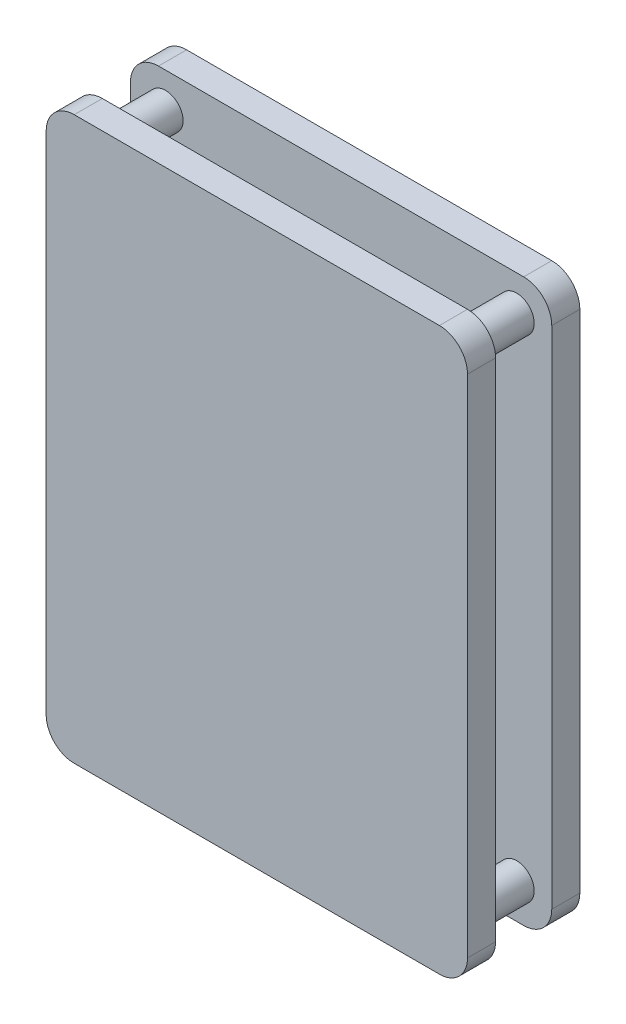
ISO-10303-21;
HEADER;
FILE_DESCRIPTION(('STEP AP214'),'2;1');
FILE_NAME('part.step','',(''),(''),'','','');
FILE_SCHEMA(('AUTOMOTIVE_DESIGN { 1 0 10303 214 1 1 1 1 }'));
ENDSEC;
DATA;
#1=APPLICATION_CONTEXT('core data for automotive mechanical design processes');
#2=APPLICATION_PROTOCOL_DEFINITION('international standard','automotive_design',2000,#1);
#3=PRODUCT_CONTEXT('',#1,'mechanical');
#4=PRODUCT('Part','Part','',(#3));
#5=PRODUCT_RELATED_PRODUCT_CATEGORY('part','',(#4));
#6=PRODUCT_DEFINITION_FORMATION('','',#4);
#7=PRODUCT_DEFINITION_CONTEXT('part definition',#1,'design');
#8=PRODUCT_DEFINITION('design','',#6,#7);
#9=PRODUCT_DEFINITION_SHAPE('','',#8);
#10=(LENGTH_UNIT() NAMED_UNIT(*) SI_UNIT(.MILLI.,.METRE.));
#11=(NAMED_UNIT(*) PLANE_ANGLE_UNIT() SI_UNIT($,.RADIAN.));
#12=(NAMED_UNIT(*) SI_UNIT($,.STERADIAN.) SOLID_ANGLE_UNIT());
#13=UNCERTAINTY_MEASURE_WITH_UNIT(LENGTH_MEASURE(1.E-05),#10,'distance_accuracy_value','');
#14=(GEOMETRIC_REPRESENTATION_CONTEXT(3) GLOBAL_UNCERTAINTY_ASSIGNED_CONTEXT((#13)) GLOBAL_UNIT_ASSIGNED_CONTEXT((#10,
#11,#12)) REPRESENTATION_CONTEXT('',''));
#15=CARTESIAN_POINT('',(0.,0.,0.));
#16=DIRECTION('',(0.,0.,1.));
#17=DIRECTION('',(1.,0.,0.));
#18=AXIS2_PLACEMENT_3D('',#15,#16,#17);
#19=CARTESIAN_POINT('',(-83.5858711935384,-160.,2.));
#20=DIRECTION('',(1.,0.,0.));
#21=DIRECTION('',(0.,0.,-1.));
#22=AXIS2_PLACEMENT_3D('',#19,#20,#21);
#23=PLANE('',#22);
#24=DIRECTION('',(0.,-1.,0.));
#25=VECTOR('',#24,1.);
#26=CARTESIAN_POINT('',(-83.5858711935384,-160.,2.));
#27=LINE('',#26,#25);
#28=CARTESIAN_POINT('',(-83.5858711935384,-162.,2.));
#29=VERTEX_POINT('',#28);
#30=CARTESIAN_POINT('',(-83.5858711935384,-198.,2.));
#31=VERTEX_POINT('',#30);
#32=EDGE_CURVE('E200',#29,#31,#27,.T.);
#33=ORIENTED_EDGE('',*,*,#32,.F.);
#34=DIRECTION('',(0.,0.,-1.));
#35=VECTOR('',#34,1.);
#36=CARTESIAN_POINT('',(-83.5858711935384,-162.,2.));
#37=LINE('',#36,#35);
#38=CARTESIAN_POINT('',(-83.5858711935384,-162.,0.));
#39=VERTEX_POINT('',#38);
#40=EDGE_CURVE('E247',#29,#39,#37,.T.);
#41=ORIENTED_EDGE('',*,*,#40,.T.);
#42=DIRECTION('',(0.,-1.,0.));
#43=VECTOR('',#42,1.);
#44=CARTESIAN_POINT('',(-83.5858711935384,-160.,0.));
#45=LINE('',#44,#43);
#46=CARTESIAN_POINT('',(-83.5858711935384,-198.,0.));
#47=VERTEX_POINT('',#46);
#48=EDGE_CURVE('E197',#39,#47,#45,.T.);
#49=ORIENTED_EDGE('',*,*,#48,.T.);
#50=DIRECTION('',(0.,0.,-1.));
#51=VECTOR('',#50,1.);
#52=CARTESIAN_POINT('',(-83.5858711935384,-198.,2.));
#53=LINE('',#52,#51);
#54=EDGE_CURVE('E245',#47,#31,#53,.F.);
#55=ORIENTED_EDGE('',*,*,#54,.T.);
#56=EDGE_LOOP('',(#33,#41,#49,#55));
#57=FACE_BOUND('',#56,.T.);
#58=ADVANCED_FACE('F32',(#57),#23,.F.);
#59=CARTESIAN_POINT('',(-83.5858711935384,-200.,2.));
#60=DIRECTION('',(0.,1.,0.));
#61=DIRECTION('',(0.,0.,1.));
#62=AXIS2_PLACEMENT_3D('',#59,#60,#61);
#63=PLANE('',#62);
#64=DIRECTION('',(1.,0.,0.));
#65=VECTOR('',#64,1.);
#66=CARTESIAN_POINT('',(-83.5858711935384,-200.,0.));
#67=LINE('',#66,#65);
#68=CARTESIAN_POINT('',(-81.5858711935384,-200.,0.));
#69=VERTEX_POINT('',#68);
#70=CARTESIAN_POINT('',(-55.5858711935384,-200.,0.));
#71=VERTEX_POINT('',#70);
#72=EDGE_CURVE('E214',#69,#71,#67,.T.);
#73=ORIENTED_EDGE('',*,*,#72,.T.);
#74=DIRECTION('',(0.,0.,-1.));
#75=VECTOR('',#74,1.);
#76=CARTESIAN_POINT('',(-55.5858711935384,-200.,2.));
#77=LINE('',#76,#75);
#78=CARTESIAN_POINT('',(-55.5858711935384,-200.,2.));
#79=VERTEX_POINT('',#78);
#80=EDGE_CURVE('E11',#71,#79,#77,.F.);
#81=ORIENTED_EDGE('',*,*,#80,.T.);
#82=DIRECTION('',(1.,0.,0.));
#83=VECTOR('',#82,1.);
#84=CARTESIAN_POINT('',(-83.5858711935384,-200.,2.));
#85=LINE('',#84,#83);
#86=CARTESIAN_POINT('',(-81.5858711935384,-200.,2.));
#87=VERTEX_POINT('',#86);
#88=EDGE_CURVE('E202',#87,#79,#85,.T.);
#89=ORIENTED_EDGE('',*,*,#88,.F.);
#90=DIRECTION('',(0.,0.,-1.));
#91=VECTOR('',#90,1.);
#92=CARTESIAN_POINT('',(-81.5858711935384,-200.,2.));
#93=LINE('',#92,#91);
#94=EDGE_CURVE('E40',#87,#69,#93,.T.);
#95=ORIENTED_EDGE('',*,*,#94,.T.);
#96=EDGE_LOOP('',(#73,#81,#89,#95));
#97=FACE_BOUND('',#96,.T.);
#98=ADVANCED_FACE('F252',(#97),#63,.F.);
#99=CARTESIAN_POINT('',(-53.5858711935384,-160.,2.));
#100=DIRECTION('',(-1.,0.,0.));
#101=DIRECTION('',(0.,0.,1.));
#102=AXIS2_PLACEMENT_3D('',#99,#100,#101);
#103=PLANE('',#102);
#104=DIRECTION('',(0.,1.,0.));
#105=VECTOR('',#104,1.);
#106=CARTESIAN_POINT('',(-53.5858711935384,-160.,0.));
#107=LINE('',#106,#105);
#108=CARTESIAN_POINT('',(-53.5858711935384,-198.,0.));
#109=VERTEX_POINT('',#108);
#110=CARTESIAN_POINT('',(-53.5858711935384,-162.,0.));
#111=VERTEX_POINT('',#110);
#112=EDGE_CURVE('E216',#109,#111,#107,.T.);
#113=ORIENTED_EDGE('',*,*,#112,.T.);
#114=DIRECTION('',(0.,0.,-1.));
#115=VECTOR('',#114,1.);
#116=CARTESIAN_POINT('',(-53.5858711935384,-162.,2.));
#117=LINE('',#116,#115);
#118=CARTESIAN_POINT('',(-53.5858711935384,-162.,2.));
#119=VERTEX_POINT('',#118);
#120=EDGE_CURVE('E236',#111,#119,#117,.F.);
#121=ORIENTED_EDGE('',*,*,#120,.T.);
#122=DIRECTION('',(0.,1.,0.));
#123=VECTOR('',#122,1.);
#124=CARTESIAN_POINT('',(-53.5858711935384,-160.,2.));
#125=LINE('',#124,#123);
#126=CARTESIAN_POINT('',(-53.5858711935384,-198.,2.));
#127=VERTEX_POINT('',#126);
#128=EDGE_CURVE('E205',#127,#119,#125,.T.);
#129=ORIENTED_EDGE('',*,*,#128,.F.);
#130=DIRECTION('',(0.,0.,-1.));
#131=VECTOR('',#130,1.);
#132=CARTESIAN_POINT('',(-53.5858711935384,-198.,2.));
#133=LINE('',#132,#131);
#134=EDGE_CURVE('E233',#127,#109,#133,.T.);
#135=ORIENTED_EDGE('',*,*,#134,.T.);
#136=EDGE_LOOP('',(#113,#121,#129,#135));
#137=FACE_BOUND('',#136,.T.);
#138=ADVANCED_FACE('F265',(#137),#103,.F.);
#139=CARTESIAN_POINT('',(-83.5858711935384,-160.,2.));
#140=DIRECTION('',(0.,-1.,0.));
#141=DIRECTION('',(0.,0.,-1.));
#142=AXIS2_PLACEMENT_3D('',#139,#140,#141);
#143=PLANE('',#142);
#144=DIRECTION('',(-1.,0.,0.));
#145=VECTOR('',#144,1.);
#146=CARTESIAN_POINT('',(-83.5858711935384,-160.,2.));
#147=LINE('',#146,#145);
#148=CARTESIAN_POINT('',(-55.5858711935384,-160.,2.));
#149=VERTEX_POINT('',#148);
#150=CARTESIAN_POINT('',(-81.5858711935384,-160.,2.));
#151=VERTEX_POINT('',#150);
#152=EDGE_CURVE('E208',#149,#151,#147,.T.);
#153=ORIENTED_EDGE('',*,*,#152,.F.);
#154=DIRECTION('',(0.,0.,-1.));
#155=VECTOR('',#154,1.);
#156=CARTESIAN_POINT('',(-55.5858711935384,-160.,2.));
#157=LINE('',#156,#155);
#158=CARTESIAN_POINT('',(-55.5858711935384,-160.,0.));
#159=VERTEX_POINT('',#158);
#160=EDGE_CURVE('E222',#149,#159,#157,.T.);
#161=ORIENTED_EDGE('',*,*,#160,.T.);
#162=DIRECTION('',(-1.,0.,0.));
#163=VECTOR('',#162,1.);
#164=CARTESIAN_POINT('',(-83.5858711935384,-160.,0.));
#165=LINE('',#164,#163);
#166=CARTESIAN_POINT('',(-81.5858711935384,-160.,0.));
#167=VERTEX_POINT('',#166);
#168=EDGE_CURVE('E203',#159,#167,#165,.T.);
#169=ORIENTED_EDGE('',*,*,#168,.T.);
#170=DIRECTION('',(0.,0.,-1.));
#171=VECTOR('',#170,1.);
#172=CARTESIAN_POINT('',(-81.5858711935384,-160.,2.));
#173=LINE('',#172,#171);
#174=EDGE_CURVE('E211',#167,#151,#173,.F.);
#175=ORIENTED_EDGE('',*,*,#174,.T.);
#176=EDGE_LOOP('',(#153,#161,#169,#175));
#177=FACE_BOUND('',#176,.T.);
#178=ADVANCED_FACE('F274',(#177),#143,.F.);
#179=CARTESIAN_POINT('',(0.,0.,2.));
#180=DIRECTION('',(0.,0.,1.));
#181=DIRECTION('',(1.,0.,0.));
#182=AXIS2_PLACEMENT_3D('',#179,#180,#181);
#183=PLANE('',#182);
#184=CARTESIAN_POINT('',(-81.0858711935384,-162.5,2.));
#185=DIRECTION('',(0.,0.,1.));
#186=DIRECTION('',(-1.,0.,0.));
#187=AXIS2_PLACEMENT_3D('',#184,#185,#186);
#188=CIRCLE('',#187,1.25);
#189=CARTESIAN_POINT('',(-82.3358711935384,-162.5,2.));
#190=VERTEX_POINT('',#189);
#191=EDGE_CURVE('E170',#190,#190,#188,.T.);
#192=ORIENTED_EDGE('',*,*,#191,.F.);
#193=EDGE_LOOP('',(#192));
#194=FACE_BOUND('',#193,.T.);
#195=CARTESIAN_POINT('',(-56.0858711935384,-162.5,2.));
#196=DIRECTION('',(0.,0.,1.));
#197=DIRECTION('',(1.,0.,0.));
#198=AXIS2_PLACEMENT_3D('',#195,#196,#197);
#199=CIRCLE('',#198,1.25);
#200=CARTESIAN_POINT('',(-54.8358711935384,-162.5,2.));
#201=VERTEX_POINT('',#200);
#202=EDGE_CURVE('E180',#201,#201,#199,.T.);
#203=ORIENTED_EDGE('',*,*,#202,.F.);
#204=EDGE_LOOP('',(#203));
#205=FACE_BOUND('',#204,.T.);
#206=CARTESIAN_POINT('',(-56.0858711935384,-197.5,2.));
#207=DIRECTION('',(0.,0.,1.));
#208=DIRECTION('',(-1.,0.,0.));
#209=AXIS2_PLACEMENT_3D('',#206,#207,#208);
#210=CIRCLE('',#209,1.25);
#211=CARTESIAN_POINT('',(-57.3358711935384,-197.5,2.));
#212=VERTEX_POINT('',#211);
#213=EDGE_CURVE('E185',#212,#212,#210,.T.);
#214=ORIENTED_EDGE('',*,*,#213,.F.);
#215=EDGE_LOOP('',(#214));
#216=FACE_BOUND('',#215,.T.);
#217=CARTESIAN_POINT('',(-81.0858711935384,-197.5,2.));
#218=DIRECTION('',(0.,0.,1.));
#219=DIRECTION('',(1.,0.,0.));
#220=AXIS2_PLACEMENT_3D('',#217,#218,#219);
#221=CIRCLE('',#220,1.25);
#222=CARTESIAN_POINT('',(-79.8358711935384,-197.5,2.));
#223=VERTEX_POINT('',#222);
#224=EDGE_CURVE('E191',#223,#223,#221,.T.);
#225=ORIENTED_EDGE('',*,*,#224,.F.);
#226=EDGE_LOOP('',(#225));
#227=FACE_BOUND('',#226,.T.);
#228=ORIENTED_EDGE('',*,*,#128,.T.);
#229=CARTESIAN_POINT('',(-55.5858711935384,-162.,2.));
#230=DIRECTION('',(0.,0.,1.));
#231=DIRECTION('',(1.,0.,0.));
#232=AXIS2_PLACEMENT_3D('',#229,#230,#231);
#233=CIRCLE('',#232,2.);
#234=EDGE_CURVE('E243',#119,#149,#233,.T.);
#235=ORIENTED_EDGE('',*,*,#234,.T.);
#236=ORIENTED_EDGE('',*,*,#152,.T.);
#237=CARTESIAN_POINT('',(-81.5858711935384,-162.,2.));
#238=DIRECTION('',(0.,0.,1.));
#239=DIRECTION('',(1.,0.,0.));
#240=AXIS2_PLACEMENT_3D('',#237,#238,#239);
#241=CIRCLE('',#240,2.);
#242=EDGE_CURVE('E241',#151,#29,#241,.T.);
#243=ORIENTED_EDGE('',*,*,#242,.T.);
#244=ORIENTED_EDGE('',*,*,#32,.T.);
#245=CARTESIAN_POINT('',(-81.5858711935384,-198.,2.));
#246=DIRECTION('',(0.,0.,1.));
#247=DIRECTION('',(1.,0.,0.));
#248=AXIS2_PLACEMENT_3D('',#245,#246,#247);
#249=CIRCLE('',#248,2.);
#250=EDGE_CURVE('E52',#31,#87,#249,.T.);
#251=ORIENTED_EDGE('',*,*,#250,.T.);
#252=ORIENTED_EDGE('',*,*,#88,.T.);
#253=CARTESIAN_POINT('',(-55.5858711935384,-198.,2.));
#254=DIRECTION('',(0.,0.,1.));
#255=DIRECTION('',(1.,0.,0.));
#256=AXIS2_PLACEMENT_3D('',#253,#254,#255);
#257=CIRCLE('',#256,2.);
#258=EDGE_CURVE('E239',#79,#127,#257,.T.);
#259=ORIENTED_EDGE('',*,*,#258,.T.);
#260=EDGE_LOOP('',(#228,#235,#236,#243,#244,#251,#252,#259));
#261=FACE_BOUND('',#260,.T.);
#262=ADVANCED_FACE('F268',(#194,#205,#216,#227,#261),#183,.T.);
#263=CARTESIAN_POINT('',(0.,0.,0.));
#264=DIRECTION('',(0.,0.,1.));
#265=DIRECTION('',(1.,0.,0.));
#266=AXIS2_PLACEMENT_3D('',#263,#264,#265);
#267=PLANE('',#266);
#268=ORIENTED_EDGE('',*,*,#168,.F.);
#269=CARTESIAN_POINT('',(-55.5858711935384,-162.,0.));
#270=DIRECTION('',(0.,0.,1.));
#271=DIRECTION('',(1.,0.,0.));
#272=AXIS2_PLACEMENT_3D('',#269,#270,#271);
#273=CIRCLE('',#272,2.);
#274=EDGE_CURVE('E231',#159,#111,#273,.F.);
#275=ORIENTED_EDGE('',*,*,#274,.T.);
#276=ORIENTED_EDGE('',*,*,#112,.F.);
#277=CARTESIAN_POINT('',(-55.5858711935384,-198.,0.));
#278=DIRECTION('',(0.,0.,1.));
#279=DIRECTION('',(1.,0.,0.));
#280=AXIS2_PLACEMENT_3D('',#277,#278,#279);
#281=CIRCLE('',#280,2.);
#282=EDGE_CURVE('E227',#109,#71,#281,.F.);
#283=ORIENTED_EDGE('',*,*,#282,.T.);
#284=ORIENTED_EDGE('',*,*,#72,.F.);
#285=CARTESIAN_POINT('',(-81.5858711935384,-198.,0.));
#286=DIRECTION('',(0.,0.,1.));
#287=DIRECTION('',(1.,0.,0.));
#288=AXIS2_PLACEMENT_3D('',#285,#286,#287);
#289=CIRCLE('',#288,2.);
#290=EDGE_CURVE('E225',#69,#47,#289,.F.);
#291=ORIENTED_EDGE('',*,*,#290,.T.);
#292=ORIENTED_EDGE('',*,*,#48,.F.);
#293=CARTESIAN_POINT('',(-81.5858711935384,-162.,0.));
#294=DIRECTION('',(0.,0.,1.));
#295=DIRECTION('',(1.,0.,0.));
#296=AXIS2_PLACEMENT_3D('',#293,#294,#295);
#297=CIRCLE('',#296,2.);
#298=EDGE_CURVE('E229',#39,#167,#297,.F.);
#299=ORIENTED_EDGE('',*,*,#298,.T.);
#300=EDGE_LOOP('',(#268,#275,#276,#283,#284,#291,#292,#299));
#301=FACE_BOUND('',#300,.T.);
#302=ADVANCED_FACE('F256',(#301),#267,.F.);
#303=CARTESIAN_POINT('',(-55.5858711935384,-162.,2.));
#304=DIRECTION('',(0.,0.,-1.));
#305=DIRECTION('',(-1.,0.,0.));
#306=AXIS2_PLACEMENT_3D('',#303,#304,#305);
#307=CYLINDRICAL_SURFACE('',#306,2.);
#308=ORIENTED_EDGE('',*,*,#234,.F.);
#309=ORIENTED_EDGE('',*,*,#120,.F.);
#310=ORIENTED_EDGE('',*,*,#274,.F.);
#311=ORIENTED_EDGE('',*,*,#160,.F.);
#312=EDGE_LOOP('',(#308,#309,#310,#311));
#313=FACE_BOUND('',#312,.T.);
#314=ADVANCED_FACE('F272',(#313),#307,.T.);
#315=CARTESIAN_POINT('',(-81.5858711935384,-162.,2.));
#316=DIRECTION('',(0.,0.,-1.));
#317=DIRECTION('',(-1.,0.,0.));
#318=AXIS2_PLACEMENT_3D('',#315,#316,#317);
#319=CYLINDRICAL_SURFACE('',#318,2.);
#320=ORIENTED_EDGE('',*,*,#242,.F.);
#321=ORIENTED_EDGE('',*,*,#174,.F.);
#322=ORIENTED_EDGE('',*,*,#298,.F.);
#323=ORIENTED_EDGE('',*,*,#40,.F.);
#324=EDGE_LOOP('',(#320,#321,#322,#323));
#325=FACE_BOUND('',#324,.T.);
#326=ADVANCED_FACE('F279',(#325),#319,.T.);
#327=CARTESIAN_POINT('',(-55.5858711935384,-198.,2.));
#328=DIRECTION('',(0.,0.,-1.));
#329=DIRECTION('',(-1.,0.,0.));
#330=AXIS2_PLACEMENT_3D('',#327,#328,#329);
#331=CYLINDRICAL_SURFACE('',#330,2.);
#332=ORIENTED_EDGE('',*,*,#258,.F.);
#333=ORIENTED_EDGE('',*,*,#80,.F.);
#334=ORIENTED_EDGE('',*,*,#282,.F.);
#335=ORIENTED_EDGE('',*,*,#134,.F.);
#336=EDGE_LOOP('',(#332,#333,#334,#335));
#337=FACE_BOUND('',#336,.T.);
#338=ADVANCED_FACE('F262',(#337),#331,.T.);
#339=CARTESIAN_POINT('',(-81.5858711935384,-198.,2.));
#340=DIRECTION('',(0.,0.,-1.));
#341=DIRECTION('',(-1.,0.,0.));
#342=AXIS2_PLACEMENT_3D('',#339,#340,#341);
#343=CYLINDRICAL_SURFACE('',#342,2.);
#344=ORIENTED_EDGE('',*,*,#250,.F.);
#345=ORIENTED_EDGE('',*,*,#54,.F.);
#346=ORIENTED_EDGE('',*,*,#290,.F.);
#347=ORIENTED_EDGE('',*,*,#94,.F.);
#348=EDGE_LOOP('',(#344,#345,#346,#347));
#349=FACE_BOUND('',#348,.T.);
#350=ADVANCED_FACE('F34',(#349),#343,.T.);
#351=CARTESIAN_POINT('',(-81.0858711935384,-197.5,6.));
#352=DIRECTION('',(0.,0.,-1.));
#353=DIRECTION('',(-1.,0.,0.));
#354=AXIS2_PLACEMENT_3D('',#351,#352,#353);
#355=CYLINDRICAL_SURFACE('',#354,1.25);
#356=CARTESIAN_POINT('',(-81.0858711935384,-197.5,6.));
#357=DIRECTION('',(0.,0.,1.));
#358=DIRECTION('',(1.,0.,0.));
#359=AXIS2_PLACEMENT_3D('',#356,#357,#358);
#360=CIRCLE('',#359,1.25);
#361=CARTESIAN_POINT('',(-79.8358711935384,-197.5,6.));
#362=VERTEX_POINT('',#361);
#363=EDGE_CURVE('E194',#362,#362,#360,.T.);
#364=ORIENTED_EDGE('',*,*,#363,.F.);
#365=EDGE_LOOP('',(#364));
#366=FACE_BOUND('',#365,.T.);
#367=ORIENTED_EDGE('',*,*,#224,.T.);
#368=EDGE_LOOP('',(#367));
#369=FACE_BOUND('',#368,.T.);
#370=ADVANCED_FACE('F284',(#366,#369),#355,.T.);
#371=CARTESIAN_POINT('',(-56.0858711935384,-197.5,6.));
#372=DIRECTION('',(0.,0.,-1.));
#373=DIRECTION('',(-1.,0.,0.));
#374=AXIS2_PLACEMENT_3D('',#371,#372,#373);
#375=CYLINDRICAL_SURFACE('',#374,1.25);
#376=CARTESIAN_POINT('',(-56.0858711935384,-197.5,6.));
#377=DIRECTION('',(0.,0.,1.));
#378=DIRECTION('',(-1.,0.,0.));
#379=AXIS2_PLACEMENT_3D('',#376,#377,#378);
#380=CIRCLE('',#379,1.25);
#381=CARTESIAN_POINT('',(-57.3358711935384,-197.5,6.));
#382=VERTEX_POINT('',#381);
#383=EDGE_CURVE('E188',#382,#382,#380,.T.);
#384=ORIENTED_EDGE('',*,*,#383,.F.);
#385=EDGE_LOOP('',(#384));
#386=FACE_BOUND('',#385,.T.);
#387=ORIENTED_EDGE('',*,*,#213,.T.);
#388=EDGE_LOOP('',(#387));
#389=FACE_BOUND('',#388,.T.);
#390=ADVANCED_FACE('F289',(#386,#389),#375,.T.);
#391=CARTESIAN_POINT('',(-56.0858711935384,-162.5,6.));
#392=DIRECTION('',(0.,0.,-1.));
#393=DIRECTION('',(-1.,0.,0.));
#394=AXIS2_PLACEMENT_3D('',#391,#392,#393);
#395=CYLINDRICAL_SURFACE('',#394,1.25);
#396=CARTESIAN_POINT('',(-56.0858711935384,-162.5,6.));
#397=DIRECTION('',(0.,0.,1.));
#398=DIRECTION('',(1.,0.,0.));
#399=AXIS2_PLACEMENT_3D('',#396,#397,#398);
#400=CIRCLE('',#399,1.25);
#401=CARTESIAN_POINT('',(-54.8358711935384,-162.5,6.));
#402=VERTEX_POINT('',#401);
#403=EDGE_CURVE('E182',#402,#402,#400,.T.);
#404=ORIENTED_EDGE('',*,*,#403,.F.);
#405=EDGE_LOOP('',(#404));
#406=FACE_BOUND('',#405,.T.);
#407=ORIENTED_EDGE('',*,*,#202,.T.);
#408=EDGE_LOOP('',(#407));
#409=FACE_BOUND('',#408,.T.);
#410=ADVANCED_FACE('F343',(#406,#409),#395,.T.);
#411=CARTESIAN_POINT('',(-81.0858711935384,-162.5,6.));
#412=DIRECTION('',(0.,0.,-1.));
#413=DIRECTION('',(-1.,0.,0.));
#414=AXIS2_PLACEMENT_3D('',#411,#412,#413);
#415=CYLINDRICAL_SURFACE('',#414,1.25);
#416=CARTESIAN_POINT('',(-81.0858711935384,-162.5,6.));
#417=DIRECTION('',(0.,0.,1.));
#418=DIRECTION('',(-1.,0.,0.));
#419=AXIS2_PLACEMENT_3D('',#416,#417,#418);
#420=CIRCLE('',#419,1.25);
#421=CARTESIAN_POINT('',(-82.3358711935384,-162.5,6.));
#422=VERTEX_POINT('',#421);
#423=EDGE_CURVE('E173',#422,#422,#420,.T.);
#424=ORIENTED_EDGE('',*,*,#423,.F.);
#425=EDGE_LOOP('',(#424));
#426=FACE_BOUND('',#425,.T.);
#427=ORIENTED_EDGE('',*,*,#191,.T.);
#428=EDGE_LOOP('',(#427));
#429=FACE_BOUND('',#428,.T.);
#430=ADVANCED_FACE('F353',(#426,#429),#415,.T.);
#431=CARTESIAN_POINT('',(-55.5858711935384,-198.,8.));
#432=DIRECTION('',(0.,0.,-1.));
#433=DIRECTION('',(-1.,0.,0.));
#434=AXIS2_PLACEMENT_3D('',#431,#432,#433);
#435=CYLINDRICAL_SURFACE('',#434,2.);
#436=CARTESIAN_POINT('',(-55.5858711935384,-198.,6.));
#437=DIRECTION('',(0.,0.,1.));
#438=DIRECTION('',(1.,0.,0.));
#439=AXIS2_PLACEMENT_3D('',#436,#437,#438);
#440=CIRCLE('',#439,2.);
#441=CARTESIAN_POINT('',(-55.5858711935384,-200.,6.));
#442=VERTEX_POINT('',#441);
#443=CARTESIAN_POINT('',(-53.5858711935384,-198.,6.));
#444=VERTEX_POINT('',#443);
#445=EDGE_CURVE('E169',#442,#444,#440,.T.);
#446=ORIENTED_EDGE('',*,*,#445,.T.);
#447=DIRECTION('',(0.,0.,-1.));
#448=VECTOR('',#447,1.);
#449=CARTESIAN_POINT('',(-53.5858711935384,-198.,8.));
#450=LINE('',#449,#448);
#451=CARTESIAN_POINT('',(-53.5858711935384,-198.,8.));
#452=VERTEX_POINT('',#451);
#453=EDGE_CURVE('E149',#452,#444,#450,.T.);
#454=ORIENTED_EDGE('',*,*,#453,.F.);
#455=CARTESIAN_POINT('',(-55.5858711935384,-198.,8.));
#456=DIRECTION('',(0.,0.,1.));
#457=DIRECTION('',(1.,0.,0.));
#458=AXIS2_PLACEMENT_3D('',#455,#456,#457);
#459=CIRCLE('',#458,2.);
#460=CARTESIAN_POINT('',(-55.5858711935384,-200.,8.));
#461=VERTEX_POINT('',#460);
#462=EDGE_CURVE('E156',#461,#452,#459,.T.);
#463=ORIENTED_EDGE('',*,*,#462,.F.);
#464=DIRECTION('',(0.,0.,-1.));
#465=VECTOR('',#464,1.);
#466=CARTESIAN_POINT('',(-55.5858711935384,-200.,8.));
#467=LINE('',#466,#465);
#468=EDGE_CURVE('E524',#461,#442,#467,.T.);
#469=ORIENTED_EDGE('',*,*,#468,.T.);
#470=EDGE_LOOP('',(#446,#454,#463,#469));
#471=FACE_BOUND('',#470,.T.);
#472=ADVANCED_FACE('F167',(#471),#435,.T.);
#473=CARTESIAN_POINT('',(-53.5858711935384,-198.,8.));
#474=DIRECTION('',(-1.,0.,0.));
#475=DIRECTION('',(0.,0.,1.));
#476=AXIS2_PLACEMENT_3D('',#473,#474,#475);
#477=PLANE('',#476);
#478=DIRECTION('',(0.,1.,0.));
#479=VECTOR('',#478,1.);
#480=CARTESIAN_POINT('',(-53.5858711935384,-198.,6.));
#481=LINE('',#480,#479);
#482=CARTESIAN_POINT('',(-53.5858711935384,-162.,6.));
#483=VERTEX_POINT('',#482);
#484=EDGE_CURVE('E507',#444,#483,#481,.T.);
#485=ORIENTED_EDGE('',*,*,#484,.T.);
#486=DIRECTION('',(0.,0.,-1.));
#487=VECTOR('',#486,1.);
#488=CARTESIAN_POINT('',(-53.5858711935384,-162.,8.));
#489=LINE('',#488,#487);
#490=CARTESIAN_POINT('',(-53.5858711935384,-162.,8.));
#491=VERTEX_POINT('',#490);
#492=EDGE_CURVE('E152',#491,#483,#489,.T.);
#493=ORIENTED_EDGE('',*,*,#492,.F.);
#494=DIRECTION('',(0.,1.,0.));
#495=VECTOR('',#494,1.);
#496=CARTESIAN_POINT('',(-53.5858711935384,-198.,8.));
#497=LINE('',#496,#495);
#498=EDGE_CURVE('E145',#452,#491,#497,.T.);
#499=ORIENTED_EDGE('',*,*,#498,.F.);
#500=ORIENTED_EDGE('',*,*,#453,.T.);
#501=EDGE_LOOP('',(#485,#493,#499,#500));
#502=FACE_BOUND('',#501,.T.);
#503=ADVANCED_FACE('F147',(#502),#477,.F.);
#504=CARTESIAN_POINT('',(-55.5858711935384,-162.,8.));
#505=DIRECTION('',(0.,0.,-1.));
#506=DIRECTION('',(-1.,0.,0.));
#507=AXIS2_PLACEMENT_3D('',#504,#505,#506);
#508=CYLINDRICAL_SURFACE('',#507,2.);
#509=CARTESIAN_POINT('',(-55.5858711935384,-162.,6.));
#510=DIRECTION('',(0.,0.,1.));
#511=DIRECTION('',(1.,0.,0.));
#512=AXIS2_PLACEMENT_3D('',#509,#510,#511);
#513=CIRCLE('',#512,2.);
#514=CARTESIAN_POINT('',(-55.5858711935384,-160.,6.));
#515=VERTEX_POINT('',#514);
#516=EDGE_CURVE('E509',#483,#515,#513,.T.);
#517=ORIENTED_EDGE('',*,*,#516,.T.);
#518=DIRECTION('',(0.,0.,-1.));
#519=VECTOR('',#518,1.);
#520=CARTESIAN_POINT('',(-55.5858711935384,-160.,8.));
#521=LINE('',#520,#519);
#522=CARTESIAN_POINT('',(-55.5858711935384,-160.,8.));
#523=VERTEX_POINT('',#522);
#524=EDGE_CURVE('E175',#523,#515,#521,.T.);
#525=ORIENTED_EDGE('',*,*,#524,.F.);
#526=CARTESIAN_POINT('',(-55.5858711935384,-162.,8.));
#527=DIRECTION('',(0.,0.,1.));
#528=DIRECTION('',(1.,0.,0.));
#529=AXIS2_PLACEMENT_3D('',#526,#527,#528);
#530=CIRCLE('',#529,2.);
#531=EDGE_CURVE('E155',#491,#523,#530,.T.);
#532=ORIENTED_EDGE('',*,*,#531,.F.);
#533=ORIENTED_EDGE('',*,*,#492,.T.);
#534=EDGE_LOOP('',(#517,#525,#532,#533));
#535=FACE_BOUND('',#534,.T.);
#536=ADVANCED_FACE('F380',(#535),#508,.T.);
#537=CARTESIAN_POINT('',(-55.5858711935384,-160.,8.));
#538=DIRECTION('',(0.,-1.,0.));
#539=DIRECTION('',(0.,0.,-1.));
#540=AXIS2_PLACEMENT_3D('',#537,#538,#539);
#541=PLANE('',#540);
#542=DIRECTION('',(-1.,0.,0.));
#543=VECTOR('',#542,1.);
#544=CARTESIAN_POINT('',(-55.5858711935384,-160.,6.));
#545=LINE('',#544,#543);
#546=CARTESIAN_POINT('',(-81.5858711935384,-160.,6.));
#547=VERTEX_POINT('',#546);
#548=EDGE_CURVE('E515',#515,#547,#545,.T.);
#549=ORIENTED_EDGE('',*,*,#548,.T.);
#550=DIRECTION('',(0.,0.,-1.));
#551=VECTOR('',#550,1.);
#552=CARTESIAN_POINT('',(-81.5858711935384,-160.,8.));
#553=LINE('',#552,#551);
#554=CARTESIAN_POINT('',(-81.5858711935384,-160.,8.));
#555=VERTEX_POINT('',#554);
#556=EDGE_CURVE('E535',#555,#547,#553,.T.);
#557=ORIENTED_EDGE('',*,*,#556,.F.);
#558=DIRECTION('',(-1.,0.,0.));
#559=VECTOR('',#558,1.);
#560=CARTESIAN_POINT('',(-55.5858711935384,-160.,8.));
#561=LINE('',#560,#559);
#562=EDGE_CURVE('E542',#523,#555,#561,.T.);
#563=ORIENTED_EDGE('',*,*,#562,.F.);
#564=ORIENTED_EDGE('',*,*,#524,.T.);
#565=EDGE_LOOP('',(#549,#557,#563,#564));
#566=FACE_BOUND('',#565,.T.);
#567=ADVANCED_FACE('F389',(#566),#541,.F.);
#568=CARTESIAN_POINT('',(-81.5858711935384,-162.,8.));
#569=DIRECTION('',(0.,0.,-1.));
#570=DIRECTION('',(-1.,0.,0.));
#571=AXIS2_PLACEMENT_3D('',#568,#569,#570);
#572=CYLINDRICAL_SURFACE('',#571,2.);
#573=CARTESIAN_POINT('',(-81.5858711935384,-162.,6.));
#574=DIRECTION('',(0.,0.,1.));
#575=DIRECTION('',(1.,0.,0.));
#576=AXIS2_PLACEMENT_3D('',#573,#574,#575);
#577=CIRCLE('',#576,2.);
#578=CARTESIAN_POINT('',(-83.5858711935384,-162.,6.));
#579=VERTEX_POINT('',#578);
#580=EDGE_CURVE('E517',#547,#579,#577,.T.);
#581=ORIENTED_EDGE('',*,*,#580,.T.);
#582=DIRECTION('',(0.,0.,-1.));
#583=VECTOR('',#582,1.);
#584=CARTESIAN_POINT('',(-83.5858711935384,-162.,8.));
#585=LINE('',#584,#583);
#586=CARTESIAN_POINT('',(-83.5858711935384,-162.,8.));
#587=VERTEX_POINT('',#586);
#588=EDGE_CURVE('E532',#587,#579,#585,.T.);
#589=ORIENTED_EDGE('',*,*,#588,.F.);
#590=CARTESIAN_POINT('',(-81.5858711935384,-162.,8.));
#591=DIRECTION('',(0.,0.,1.));
#592=DIRECTION('',(1.,0.,0.));
#593=AXIS2_PLACEMENT_3D('',#590,#591,#592);
#594=CIRCLE('',#593,2.);
#595=EDGE_CURVE('E552',#555,#587,#594,.T.);
#596=ORIENTED_EDGE('',*,*,#595,.F.);
#597=ORIENTED_EDGE('',*,*,#556,.T.);
#598=EDGE_LOOP('',(#581,#589,#596,#597));
#599=FACE_BOUND('',#598,.T.);
#600=ADVANCED_FACE('F399',(#599),#572,.T.);
#601=CARTESIAN_POINT('',(-83.5858711935384,-162.,8.));
#602=DIRECTION('',(1.,0.,0.));
#603=DIRECTION('',(0.,0.,-1.));
#604=AXIS2_PLACEMENT_3D('',#601,#602,#603);
#605=PLANE('',#604);
#606=DIRECTION('',(0.,-1.,0.));
#607=VECTOR('',#606,1.);
#608=CARTESIAN_POINT('',(-83.5858711935384,-162.,6.));
#609=LINE('',#608,#607);
#610=CARTESIAN_POINT('',(-83.5858711935384,-198.,6.));
#611=VERTEX_POINT('',#610);
#612=EDGE_CURVE('E519',#579,#611,#609,.T.);
#613=ORIENTED_EDGE('',*,*,#612,.T.);
#614=DIRECTION('',(0.,0.,-1.));
#615=VECTOR('',#614,1.);
#616=CARTESIAN_POINT('',(-83.5858711935384,-198.,8.));
#617=LINE('',#616,#615);
#618=CARTESIAN_POINT('',(-83.5858711935384,-198.,8.));
#619=VERTEX_POINT('',#618);
#620=EDGE_CURVE('E529',#619,#611,#617,.T.);
#621=ORIENTED_EDGE('',*,*,#620,.F.);
#622=DIRECTION('',(0.,-1.,0.));
#623=VECTOR('',#622,1.);
#624=CARTESIAN_POINT('',(-83.5858711935384,-162.,8.));
#625=LINE('',#624,#623);
#626=EDGE_CURVE('E549',#587,#619,#625,.T.);
#627=ORIENTED_EDGE('',*,*,#626,.F.);
#628=ORIENTED_EDGE('',*,*,#588,.T.);
#629=EDGE_LOOP('',(#613,#621,#627,#628));
#630=FACE_BOUND('',#629,.T.);
#631=ADVANCED_FACE('F409',(#630),#605,.F.);
#632=CARTESIAN_POINT('',(-81.5858711935384,-198.,8.));
#633=DIRECTION('',(0.,0.,-1.));
#634=DIRECTION('',(-1.,0.,0.));
#635=AXIS2_PLACEMENT_3D('',#632,#633,#634);
#636=CYLINDRICAL_SURFACE('',#635,2.);
#637=CARTESIAN_POINT('',(-81.5858711935384,-198.,6.));
#638=DIRECTION('',(0.,0.,1.));
#639=DIRECTION('',(1.,0.,0.));
#640=AXIS2_PLACEMENT_3D('',#637,#638,#639);
#641=CIRCLE('',#640,2.);
#642=CARTESIAN_POINT('',(-81.5858711935384,-200.,6.));
#643=VERTEX_POINT('',#642);
#644=EDGE_CURVE('E521',#611,#643,#641,.T.);
#645=ORIENTED_EDGE('',*,*,#644,.T.);
#646=DIRECTION('',(0.,0.,-1.));
#647=VECTOR('',#646,1.);
#648=CARTESIAN_POINT('',(-81.5858711935384,-200.,8.));
#649=LINE('',#648,#647);
#650=CARTESIAN_POINT('',(-81.5858711935384,-200.,8.));
#651=VERTEX_POINT('',#650);
#652=EDGE_CURVE('E526',#651,#643,#649,.T.);
#653=ORIENTED_EDGE('',*,*,#652,.F.);
#654=CARTESIAN_POINT('',(-81.5858711935384,-198.,8.));
#655=DIRECTION('',(0.,0.,1.));
#656=DIRECTION('',(1.,0.,0.));
#657=AXIS2_PLACEMENT_3D('',#654,#655,#656);
#658=CIRCLE('',#657,2.);
#659=EDGE_CURVE('E551',#619,#651,#658,.T.);
#660=ORIENTED_EDGE('',*,*,#659,.F.);
#661=ORIENTED_EDGE('',*,*,#620,.T.);
#662=EDGE_LOOP('',(#645,#653,#660,#661));
#663=FACE_BOUND('',#662,.T.);
#664=ADVANCED_FACE('F419',(#663),#636,.T.);
#665=CARTESIAN_POINT('',(-81.5858711935384,-200.,8.));
#666=DIRECTION('',(0.,1.,0.));
#667=DIRECTION('',(0.,0.,1.));
#668=AXIS2_PLACEMENT_3D('',#665,#666,#667);
#669=PLANE('',#668);
#670=DIRECTION('',(1.,0.,0.));
#671=VECTOR('',#670,1.);
#672=CARTESIAN_POINT('',(-81.5858711935384,-200.,6.));
#673=LINE('',#672,#671);
#674=EDGE_CURVE('E165',#643,#442,#673,.T.);
#675=ORIENTED_EDGE('',*,*,#674,.T.);
#676=ORIENTED_EDGE('',*,*,#468,.F.);
#677=DIRECTION('',(1.,0.,0.));
#678=VECTOR('',#677,1.);
#679=CARTESIAN_POINT('',(-81.5858711935384,-200.,8.));
#680=LINE('',#679,#678);
#681=EDGE_CURVE('E161',#651,#461,#680,.T.);
#682=ORIENTED_EDGE('',*,*,#681,.F.);
#683=ORIENTED_EDGE('',*,*,#652,.T.);
#684=EDGE_LOOP('',(#675,#676,#682,#683));
#685=FACE_BOUND('',#684,.T.);
#686=ADVANCED_FACE('F429',(#685),#669,.F.);
#687=CARTESIAN_POINT('',(-55.5858711935384,-198.,8.));
#688=DIRECTION('',(0.,0.,1.));
#689=DIRECTION('',(1.,0.,0.));
#690=AXIS2_PLACEMENT_3D('',#687,#688,#689);
#691=PLANE('',#690);
#692=ORIENTED_EDGE('',*,*,#462,.T.);
#693=ORIENTED_EDGE('',*,*,#498,.T.);
#694=ORIENTED_EDGE('',*,*,#531,.T.);
#695=ORIENTED_EDGE('',*,*,#562,.T.);
#696=ORIENTED_EDGE('',*,*,#595,.T.);
#697=ORIENTED_EDGE('',*,*,#626,.T.);
#698=ORIENTED_EDGE('',*,*,#659,.T.);
#699=ORIENTED_EDGE('',*,*,#681,.T.);
#700=EDGE_LOOP('',(#692,#693,#694,#695,#696,#697,#698,#699));
#701=FACE_BOUND('',#700,.T.);
#702=ADVANCED_FACE('F159',(#701),#691,.T.);
#703=CARTESIAN_POINT('',(-55.5858711935384,-198.,6.));
#704=DIRECTION('',(0.,0.,1.));
#705=DIRECTION('',(1.,0.,0.));
#706=AXIS2_PLACEMENT_3D('',#703,#704,#705);
#707=PLANE('',#706);
#708=ORIENTED_EDGE('',*,*,#363,.T.);
#709=EDGE_LOOP('',(#708));
#710=FACE_BOUND('',#709,.T.);
#711=ORIENTED_EDGE('',*,*,#383,.T.);
#712=EDGE_LOOP('',(#711));
#713=FACE_BOUND('',#712,.T.);
#714=ORIENTED_EDGE('',*,*,#403,.T.);
#715=EDGE_LOOP('',(#714));
#716=FACE_BOUND('',#715,.T.);
#717=ORIENTED_EDGE('',*,*,#423,.T.);
#718=EDGE_LOOP('',(#717));
#719=FACE_BOUND('',#718,.T.);
#720=ORIENTED_EDGE('',*,*,#445,.F.);
#721=ORIENTED_EDGE('',*,*,#674,.F.);
#722=ORIENTED_EDGE('',*,*,#644,.F.);
#723=ORIENTED_EDGE('',*,*,#612,.F.);
#724=ORIENTED_EDGE('',*,*,#580,.F.);
#725=ORIENTED_EDGE('',*,*,#548,.F.);
#726=ORIENTED_EDGE('',*,*,#516,.F.);
#727=ORIENTED_EDGE('',*,*,#484,.F.);
#728=EDGE_LOOP('',(#720,#721,#722,#723,#724,#725,#726,#727));
#729=FACE_BOUND('',#728,.T.);
#730=ADVANCED_FACE('F448',(#710,#713,#716,#719,#729),#707,.F.);
#731=CLOSED_SHELL('',(#58,#98,#138,#178,#262,#302,#314,#326,#338,#350,#370,#390,#410,#430,#472,
#503,#536,#567,#600,#631,#664,#686,#702,#730));
#732=MANIFOLD_SOLID_BREP('B2',#731);
#733=ADVANCED_BREP_SHAPE_REPRESENTATION('',(#18,#732),#14);
#734=SHAPE_DEFINITION_REPRESENTATION(#9,#733);
ENDSEC;
END-ISO-10303-21;
